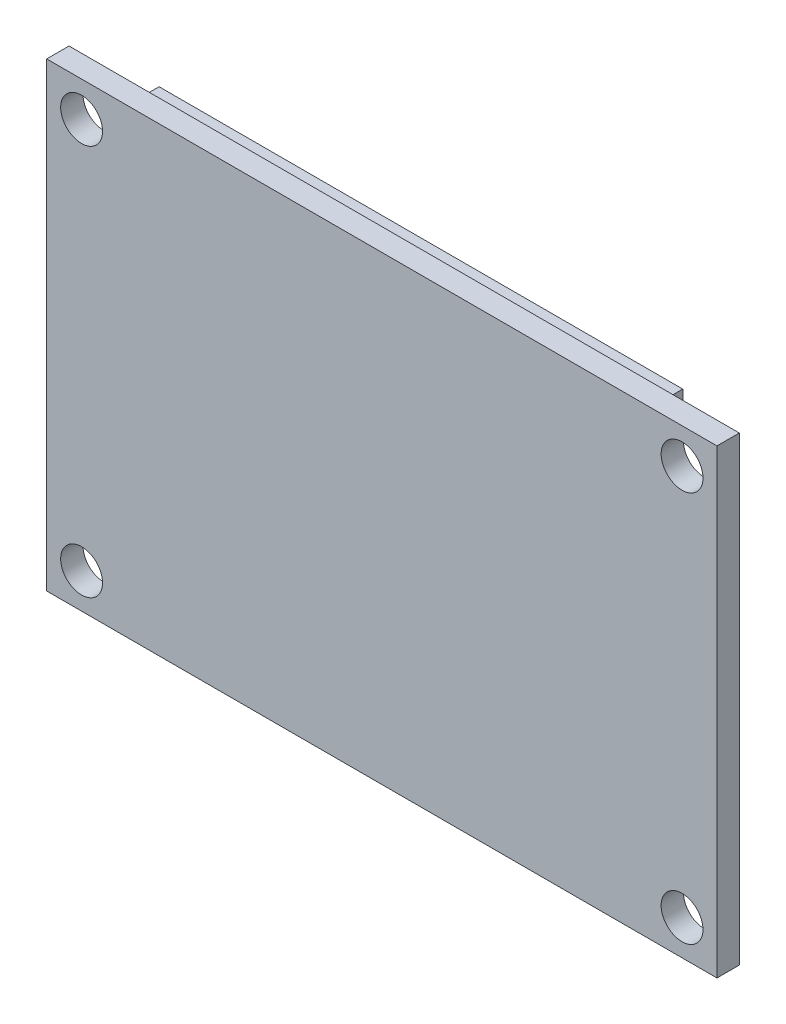
ISO-10303-21;
HEADER;
FILE_DESCRIPTION(('STEP AP214'),'2;1');
FILE_NAME('part.step','',(''),(''),'','','');
FILE_SCHEMA(('AUTOMOTIVE_DESIGN { 1 0 10303 214 1 1 1 1 }'));
ENDSEC;
DATA;
#1=APPLICATION_CONTEXT('core data for automotive mechanical design processes');
#2=APPLICATION_PROTOCOL_DEFINITION('international standard','automotive_design',2000,#1);
#3=PRODUCT_CONTEXT('',#1,'mechanical');
#4=PRODUCT('Part','Part','',(#3));
#5=PRODUCT_RELATED_PRODUCT_CATEGORY('part','',(#4));
#6=PRODUCT_DEFINITION_FORMATION('','',#4);
#7=PRODUCT_DEFINITION_CONTEXT('part definition',#1,'design');
#8=PRODUCT_DEFINITION('design','',#6,#7);
#9=PRODUCT_DEFINITION_SHAPE('','',#8);
#10=(LENGTH_UNIT() NAMED_UNIT(*) SI_UNIT(.MILLI.,.METRE.));
#11=(NAMED_UNIT(*) PLANE_ANGLE_UNIT() SI_UNIT($,.RADIAN.));
#12=(NAMED_UNIT(*) SI_UNIT($,.STERADIAN.) SOLID_ANGLE_UNIT());
#13=UNCERTAINTY_MEASURE_WITH_UNIT(LENGTH_MEASURE(1.E-05),#10,'distance_accuracy_value','');
#14=(GEOMETRIC_REPRESENTATION_CONTEXT(3) GLOBAL_UNCERTAINTY_ASSIGNED_CONTEXT((#13)) GLOBAL_UNIT_ASSIGNED_CONTEXT((#10,
#11,#12)) REPRESENTATION_CONTEXT('',''));
#15=CARTESIAN_POINT('',(0.,0.,0.));
#16=DIRECTION('',(0.,0.,1.));
#17=DIRECTION('',(1.,0.,0.));
#18=AXIS2_PLACEMENT_3D('',#15,#16,#17);
#19=CARTESIAN_POINT('',(0.,0.,1.6));
#20=DIRECTION('',(0.,0.,-1.));
#21=DIRECTION('',(-1.,0.,0.));
#22=AXIS2_PLACEMENT_3D('',#19,#20,#21);
#23=PLANE('',#22);
#24=DIRECTION('',(0.,-1.,0.));
#25=VECTOR('',#24,1.);
#26=CARTESIAN_POINT('',(-24.,16.5,1.6));
#27=LINE('',#26,#25);
#28=CARTESIAN_POINT('',(-24.,16.5,1.6));
#29=VERTEX_POINT('',#28);
#30=CARTESIAN_POINT('',(-24.,-16.5,1.6));
#31=VERTEX_POINT('',#30);
#32=EDGE_CURVE('E254',#29,#31,#27,.T.);
#33=ORIENTED_EDGE('',*,*,#32,.T.);
#34=DIRECTION('',(1.,0.,0.));
#35=VECTOR('',#34,1.);
#36=CARTESIAN_POINT('',(24.,-16.5,1.6));
#37=LINE('',#36,#35);
#38=CARTESIAN_POINT('',(24.,-16.5,1.6));
#39=VERTEX_POINT('',#38);
#40=EDGE_CURVE('E258',#31,#39,#37,.T.);
#41=ORIENTED_EDGE('',*,*,#40,.T.);
#42=DIRECTION('',(0.,1.,0.));
#43=VECTOR('',#42,1.);
#44=CARTESIAN_POINT('',(24.,16.5,1.6));
#45=LINE('',#44,#43);
#46=CARTESIAN_POINT('',(24.,16.5,1.6));
#47=VERTEX_POINT('',#46);
#48=EDGE_CURVE('E262',#39,#47,#45,.T.);
#49=ORIENTED_EDGE('',*,*,#48,.T.);
#50=DIRECTION('',(-1.,0.,0.));
#51=VECTOR('',#50,1.);
#52=CARTESIAN_POINT('',(24.,16.5,1.6));
#53=LINE('',#52,#51);
#54=EDGE_CURVE('E265',#47,#29,#53,.T.);
#55=ORIENTED_EDGE('',*,*,#54,.T.);
#56=EDGE_LOOP('',(#33,#41,#49,#55));
#57=FACE_BOUND('',#56,.T.);
#58=CARTESIAN_POINT('',(-21.5,14.,1.6));
#59=DIRECTION('',(0.,0.,1.));
#60=DIRECTION('',(1.,0.,0.));
#61=AXIS2_PLACEMENT_3D('',#58,#59,#60);
#62=CIRCLE('',#61,1.5);
#63=CARTESIAN_POINT('',(-20.,14.,1.6));
#64=VERTEX_POINT('',#63);
#65=EDGE_CURVE('E246',#64,#64,#62,.T.);
#66=ORIENTED_EDGE('',*,*,#65,.F.);
#67=EDGE_LOOP('',(#66));
#68=FACE_BOUND('',#67,.T.);
#69=CARTESIAN_POINT('',(-21.5,-14.,1.6));
#70=DIRECTION('',(0.,0.,1.));
#71=DIRECTION('',(1.,0.,0.));
#72=AXIS2_PLACEMENT_3D('',#69,#70,#71);
#73=CIRCLE('',#72,1.5);
#74=CARTESIAN_POINT('',(-20.,-14.,1.6));
#75=VERTEX_POINT('',#74);
#76=EDGE_CURVE('E238',#75,#75,#73,.T.);
#77=ORIENTED_EDGE('',*,*,#76,.F.);
#78=EDGE_LOOP('',(#77));
#79=FACE_BOUND('',#78,.T.);
#80=CARTESIAN_POINT('',(21.5,-14.,1.6));
#81=DIRECTION('',(0.,0.,1.));
#82=DIRECTION('',(-1.,0.,0.));
#83=AXIS2_PLACEMENT_3D('',#80,#81,#82);
#84=CIRCLE('',#83,1.5);
#85=CARTESIAN_POINT('',(20.,-14.,1.6));
#86=VERTEX_POINT('',#85);
#87=EDGE_CURVE('E230',#86,#86,#84,.T.);
#88=ORIENTED_EDGE('',*,*,#87,.F.);
#89=EDGE_LOOP('',(#88));
#90=FACE_BOUND('',#89,.T.);
#91=CARTESIAN_POINT('',(21.5,14.,1.6));
#92=DIRECTION('',(0.,0.,1.));
#93=DIRECTION('',(-1.,0.,0.));
#94=AXIS2_PLACEMENT_3D('',#91,#92,#93);
#95=CIRCLE('',#94,1.5);
#96=CARTESIAN_POINT('',(20.,14.,1.6));
#97=VERTEX_POINT('',#96);
#98=EDGE_CURVE('E222',#97,#97,#95,.T.);
#99=ORIENTED_EDGE('',*,*,#98,.F.);
#100=EDGE_LOOP('',(#99));
#101=FACE_BOUND('',#100,.T.);
#102=ADVANCED_FACE('F39',(#57,#68,#79,#90,#101),#23,.F.);
#103=CARTESIAN_POINT('',(0.,0.,0.));
#104=DIRECTION('',(0.,0.,-1.));
#105=DIRECTION('',(-1.,0.,0.));
#106=AXIS2_PLACEMENT_3D('',#103,#104,#105);
#107=PLANE('',#106);
#108=DIRECTION('',(0.,-1.,0.));
#109=VECTOR('',#108,1.);
#110=CARTESIAN_POINT('',(-18.75,16.,0.));
#111=LINE('',#110,#109);
#112=CARTESIAN_POINT('',(-18.75,16.,0.));
#113=VERTEX_POINT('',#112);
#114=CARTESIAN_POINT('',(-18.75,-16.,0.));
#115=VERTEX_POINT('',#114);
#116=EDGE_CURVE('E174',#113,#115,#111,.T.);
#117=ORIENTED_EDGE('',*,*,#116,.T.);
#118=DIRECTION('',(1.,0.,0.));
#119=VECTOR('',#118,1.);
#120=CARTESIAN_POINT('',(18.75,-16.,0.));
#121=LINE('',#120,#119);
#122=CARTESIAN_POINT('',(18.75,-16.,0.));
#123=VERTEX_POINT('',#122);
#124=EDGE_CURVE('E199',#115,#123,#121,.T.);
#125=ORIENTED_EDGE('',*,*,#124,.T.);
#126=DIRECTION('',(0.,1.,0.));
#127=VECTOR('',#126,1.);
#128=CARTESIAN_POINT('',(18.75,16.,0.));
#129=LINE('',#128,#127);
#130=CARTESIAN_POINT('',(18.75,16.,0.));
#131=VERTEX_POINT('',#130);
#132=EDGE_CURVE('E202',#123,#131,#129,.T.);
#133=ORIENTED_EDGE('',*,*,#132,.T.);
#134=DIRECTION('',(-1.,0.,0.));
#135=VECTOR('',#134,1.);
#136=CARTESIAN_POINT('',(18.75,16.,0.));
#137=LINE('',#136,#135);
#138=EDGE_CURVE('E63',#131,#113,#137,.T.);
#139=ORIENTED_EDGE('',*,*,#138,.T.);
#140=EDGE_LOOP('',(#117,#125,#133,#139));
#141=FACE_BOUND('',#140,.T.);
#142=CARTESIAN_POINT('',(21.5,-14.,0.));
#143=DIRECTION('',(0.,0.,1.));
#144=DIRECTION('',(-1.,0.,0.));
#145=AXIS2_PLACEMENT_3D('',#142,#143,#144);
#146=CIRCLE('',#145,1.5);
#147=CARTESIAN_POINT('',(20.,-14.,0.));
#148=VERTEX_POINT('',#147);
#149=EDGE_CURVE('E226',#148,#148,#146,.T.);
#150=ORIENTED_EDGE('',*,*,#149,.T.);
#151=EDGE_LOOP('',(#150));
#152=FACE_BOUND('',#151,.T.);
#153=CARTESIAN_POINT('',(-21.5,14.,0.));
#154=DIRECTION('',(0.,0.,1.));
#155=DIRECTION('',(1.,0.,0.));
#156=AXIS2_PLACEMENT_3D('',#153,#154,#155);
#157=CIRCLE('',#156,1.5);
#158=CARTESIAN_POINT('',(-20.,14.,0.));
#159=VERTEX_POINT('',#158);
#160=EDGE_CURVE('E242',#159,#159,#157,.T.);
#161=ORIENTED_EDGE('',*,*,#160,.T.);
#162=EDGE_LOOP('',(#161));
#163=FACE_BOUND('',#162,.T.);
#164=DIRECTION('',(0.,-1.,0.));
#165=VECTOR('',#164,1.);
#166=CARTESIAN_POINT('',(-24.,16.5,0.));
#167=LINE('',#166,#165);
#168=CARTESIAN_POINT('',(-24.,16.5,0.));
#169=VERTEX_POINT('',#168);
#170=CARTESIAN_POINT('',(-24.,-16.5,0.));
#171=VERTEX_POINT('',#170);
#172=EDGE_CURVE('E250',#169,#171,#167,.T.);
#173=ORIENTED_EDGE('',*,*,#172,.F.);
#174=DIRECTION('',(-1.,0.,0.));
#175=VECTOR('',#174,1.);
#176=CARTESIAN_POINT('',(24.,16.5,0.));
#177=LINE('',#176,#175);
#178=CARTESIAN_POINT('',(24.,16.5,0.));
#179=VERTEX_POINT('',#178);
#180=EDGE_CURVE('E259',#179,#169,#177,.T.);
#181=ORIENTED_EDGE('',*,*,#180,.F.);
#182=DIRECTION('',(0.,1.,0.));
#183=VECTOR('',#182,1.);
#184=CARTESIAN_POINT('',(24.,16.5,0.));
#185=LINE('',#184,#183);
#186=CARTESIAN_POINT('',(24.,-16.5,0.));
#187=VERTEX_POINT('',#186);
#188=EDGE_CURVE('E275',#187,#179,#185,.T.);
#189=ORIENTED_EDGE('',*,*,#188,.F.);
#190=DIRECTION('',(1.,0.,0.));
#191=VECTOR('',#190,1.);
#192=CARTESIAN_POINT('',(24.,-16.5,0.));
#193=LINE('',#192,#191);
#194=EDGE_CURVE('E272',#171,#187,#193,.T.);
#195=ORIENTED_EDGE('',*,*,#194,.F.);
#196=EDGE_LOOP('',(#173,#181,#189,#195));
#197=FACE_BOUND('',#196,.T.);
#198=CARTESIAN_POINT('',(-21.5,-14.,0.));
#199=DIRECTION('',(0.,0.,1.));
#200=DIRECTION('',(1.,0.,0.));
#201=AXIS2_PLACEMENT_3D('',#198,#199,#200);
#202=CIRCLE('',#201,1.5);
#203=CARTESIAN_POINT('',(-20.,-14.,0.));
#204=VERTEX_POINT('',#203);
#205=EDGE_CURVE('E234',#204,#204,#202,.T.);
#206=ORIENTED_EDGE('',*,*,#205,.T.);
#207=EDGE_LOOP('',(#206));
#208=FACE_BOUND('',#207,.T.);
#209=CARTESIAN_POINT('',(21.5,14.,0.));
#210=DIRECTION('',(0.,0.,1.));
#211=DIRECTION('',(-1.,0.,0.));
#212=AXIS2_PLACEMENT_3D('',#209,#210,#211);
#213=CIRCLE('',#212,1.5);
#214=CARTESIAN_POINT('',(20.,14.,0.));
#215=VERTEX_POINT('',#214);
#216=EDGE_CURVE('E210',#215,#215,#213,.T.);
#217=ORIENTED_EDGE('',*,*,#216,.T.);
#218=EDGE_LOOP('',(#217));
#219=FACE_BOUND('',#218,.T.);
#220=ADVANCED_FACE('F298',(#141,#152,#163,#197,#208,#219),#107,.T.);
#221=CARTESIAN_POINT('',(-24.,16.5,1.6));
#222=DIRECTION('',(1.,0.,0.));
#223=DIRECTION('',(0.,1.,0.));
#224=AXIS2_PLACEMENT_3D('',#221,#222,#223);
#225=PLANE('',#224);
#226=ORIENTED_EDGE('',*,*,#172,.T.);
#227=DIRECTION('',(0.,0.,-1.));
#228=VECTOR('',#227,1.);
#229=CARTESIAN_POINT('',(-24.,-16.5,1.6));
#230=LINE('',#229,#228);
#231=EDGE_CURVE('E11',#31,#171,#230,.T.);
#232=ORIENTED_EDGE('',*,*,#231,.F.);
#233=ORIENTED_EDGE('',*,*,#32,.F.);
#234=DIRECTION('',(0.,0.,-1.));
#235=VECTOR('',#234,1.);
#236=CARTESIAN_POINT('',(-24.,16.5,1.6));
#237=LINE('',#236,#235);
#238=EDGE_CURVE('E268',#29,#169,#237,.T.);
#239=ORIENTED_EDGE('',*,*,#238,.T.);
#240=EDGE_LOOP('',(#226,#232,#233,#239));
#241=FACE_BOUND('',#240,.T.);
#242=ADVANCED_FACE('F41',(#241),#225,.F.);
#243=CARTESIAN_POINT('',(24.,-16.5,1.6));
#244=DIRECTION('',(0.,1.,0.));
#245=DIRECTION('',(-1.,0.,0.));
#246=AXIS2_PLACEMENT_3D('',#243,#244,#245);
#247=PLANE('',#246);
#248=ORIENTED_EDGE('',*,*,#194,.T.);
#249=DIRECTION('',(0.,0.,-1.));
#250=VECTOR('',#249,1.);
#251=CARTESIAN_POINT('',(24.,-16.5,1.6));
#252=LINE('',#251,#250);
#253=EDGE_CURVE('E48',#39,#187,#252,.T.);
#254=ORIENTED_EDGE('',*,*,#253,.F.);
#255=ORIENTED_EDGE('',*,*,#40,.F.);
#256=ORIENTED_EDGE('',*,*,#231,.T.);
#257=EDGE_LOOP('',(#248,#254,#255,#256));
#258=FACE_BOUND('',#257,.T.);
#259=ADVANCED_FACE('F309',(#258),#247,.F.);
#260=CARTESIAN_POINT('',(24.,16.5,1.6));
#261=DIRECTION('',(-1.,0.,0.));
#262=DIRECTION('',(0.,-1.,0.));
#263=AXIS2_PLACEMENT_3D('',#260,#261,#262);
#264=PLANE('',#263);
#265=ORIENTED_EDGE('',*,*,#188,.T.);
#266=DIRECTION('',(0.,0.,-1.));
#267=VECTOR('',#266,1.);
#268=CARTESIAN_POINT('',(24.,16.5,1.6));
#269=LINE('',#268,#267);
#270=EDGE_CURVE('E283',#47,#179,#269,.T.);
#271=ORIENTED_EDGE('',*,*,#270,.F.);
#272=ORIENTED_EDGE('',*,*,#48,.F.);
#273=ORIENTED_EDGE('',*,*,#253,.T.);
#274=EDGE_LOOP('',(#265,#271,#272,#273));
#275=FACE_BOUND('',#274,.T.);
#276=ADVANCED_FACE('F292',(#275),#264,.F.);
#277=CARTESIAN_POINT('',(24.,16.5,1.6));
#278=DIRECTION('',(0.,-1.,0.));
#279=DIRECTION('',(1.,0.,0.));
#280=AXIS2_PLACEMENT_3D('',#277,#278,#279);
#281=PLANE('',#280);
#282=ORIENTED_EDGE('',*,*,#180,.T.);
#283=ORIENTED_EDGE('',*,*,#238,.F.);
#284=ORIENTED_EDGE('',*,*,#54,.F.);
#285=ORIENTED_EDGE('',*,*,#270,.T.);
#286=EDGE_LOOP('',(#282,#283,#284,#285));
#287=FACE_BOUND('',#286,.T.);
#288=ADVANCED_FACE('F302',(#287),#281,.F.);
#289=CARTESIAN_POINT('',(-21.5,14.,1.6));
#290=DIRECTION('',(0.,0.,-1.));
#291=DIRECTION('',(-1.,0.,0.));
#292=AXIS2_PLACEMENT_3D('',#289,#290,#291);
#293=CYLINDRICAL_SURFACE('',#292,1.5);
#294=ORIENTED_EDGE('',*,*,#65,.T.);
#295=EDGE_LOOP('',(#294));
#296=FACE_BOUND('',#295,.T.);
#297=ORIENTED_EDGE('',*,*,#160,.F.);
#298=EDGE_LOOP('',(#297));
#299=FACE_BOUND('',#298,.T.);
#300=ADVANCED_FACE('F323',(#296,#299),#293,.F.);
#301=CARTESIAN_POINT('',(-21.5,-14.,1.6));
#302=DIRECTION('',(0.,0.,-1.));
#303=DIRECTION('',(-1.,0.,0.));
#304=AXIS2_PLACEMENT_3D('',#301,#302,#303);
#305=CYLINDRICAL_SURFACE('',#304,1.5);
#306=ORIENTED_EDGE('',*,*,#76,.T.);
#307=EDGE_LOOP('',(#306));
#308=FACE_BOUND('',#307,.T.);
#309=ORIENTED_EDGE('',*,*,#205,.F.);
#310=EDGE_LOOP('',(#309));
#311=FACE_BOUND('',#310,.T.);
#312=ADVANCED_FACE('F330',(#308,#311),#305,.F.);
#313=CARTESIAN_POINT('',(21.5,-14.,1.6));
#314=DIRECTION('',(0.,0.,-1.));
#315=DIRECTION('',(-1.,0.,0.));
#316=AXIS2_PLACEMENT_3D('',#313,#314,#315);
#317=CYLINDRICAL_SURFACE('',#316,1.5);
#318=ORIENTED_EDGE('',*,*,#87,.T.);
#319=EDGE_LOOP('',(#318));
#320=FACE_BOUND('',#319,.T.);
#321=ORIENTED_EDGE('',*,*,#149,.F.);
#322=EDGE_LOOP('',(#321));
#323=FACE_BOUND('',#322,.T.);
#324=ADVANCED_FACE('F335',(#320,#323),#317,.F.);
#325=CARTESIAN_POINT('',(21.5,14.,1.6));
#326=DIRECTION('',(0.,0.,-1.));
#327=DIRECTION('',(-1.,0.,0.));
#328=AXIS2_PLACEMENT_3D('',#325,#326,#327);
#329=CYLINDRICAL_SURFACE('',#328,1.5);
#330=ORIENTED_EDGE('',*,*,#98,.T.);
#331=EDGE_LOOP('',(#330));
#332=FACE_BOUND('',#331,.T.);
#333=ORIENTED_EDGE('',*,*,#216,.F.);
#334=EDGE_LOOP('',(#333));
#335=FACE_BOUND('',#334,.T.);
#336=ADVANCED_FACE('F348',(#332,#335),#329,.F.);
#337=CARTESIAN_POINT('',(-18.75,16.,-1.2));
#338=DIRECTION('',(-1.,0.,0.));
#339=DIRECTION('',(0.,-1.,0.));
#340=AXIS2_PLACEMENT_3D('',#337,#338,#339);
#341=PLANE('',#340);
#342=ORIENTED_EDGE('',*,*,#116,.F.);
#343=DIRECTION('',(0.,0.,1.));
#344=VECTOR('',#343,1.);
#345=CARTESIAN_POINT('',(-18.75,16.,-1.2));
#346=LINE('',#345,#344);
#347=CARTESIAN_POINT('',(-18.75,16.,-1.2));
#348=VERTEX_POINT('',#347);
#349=EDGE_CURVE('E207',#348,#113,#346,.T.);
#350=ORIENTED_EDGE('',*,*,#349,.F.);
#351=DIRECTION('',(0.,-1.,0.));
#352=VECTOR('',#351,1.);
#353=CARTESIAN_POINT('',(-18.75,16.,-1.2));
#354=LINE('',#353,#352);
#355=CARTESIAN_POINT('',(-18.75,-16.,-1.2));
#356=VERTEX_POINT('',#355);
#357=EDGE_CURVE('E180',#348,#356,#354,.T.);
#358=ORIENTED_EDGE('',*,*,#357,.T.);
#359=DIRECTION('',(0.,0.,1.));
#360=VECTOR('',#359,1.);
#361=CARTESIAN_POINT('',(-18.75,-16.,-1.2));
#362=LINE('',#361,#360);
#363=EDGE_CURVE('E196',#356,#115,#362,.T.);
#364=ORIENTED_EDGE('',*,*,#363,.T.);
#365=EDGE_LOOP('',(#342,#350,#358,#364));
#366=FACE_BOUND('',#365,.T.);
#367=ADVANCED_FACE('F351',(#366),#341,.T.);
#368=CARTESIAN_POINT('',(18.75,16.,-1.2));
#369=DIRECTION('',(0.,1.,0.));
#370=DIRECTION('',(-1.,0.,0.));
#371=AXIS2_PLACEMENT_3D('',#368,#369,#370);
#372=PLANE('',#371);
#373=ORIENTED_EDGE('',*,*,#138,.F.);
#374=DIRECTION('',(0.,0.,1.));
#375=VECTOR('',#374,1.);
#376=CARTESIAN_POINT('',(18.75,16.,-1.2));
#377=LINE('',#376,#375);
#378=CARTESIAN_POINT('',(18.75,16.,-1.2));
#379=VERTEX_POINT('',#378);
#380=EDGE_CURVE('E211',#379,#131,#377,.T.);
#381=ORIENTED_EDGE('',*,*,#380,.F.);
#382=DIRECTION('',(-1.,0.,0.));
#383=VECTOR('',#382,1.);
#384=CARTESIAN_POINT('',(18.75,16.,-1.2));
#385=LINE('',#384,#383);
#386=EDGE_CURVE('E192',#379,#348,#385,.T.);
#387=ORIENTED_EDGE('',*,*,#386,.T.);
#388=ORIENTED_EDGE('',*,*,#349,.T.);
#389=EDGE_LOOP('',(#373,#381,#387,#388));
#390=FACE_BOUND('',#389,.T.);
#391=ADVANCED_FACE('F359',(#390),#372,.T.);
#392=CARTESIAN_POINT('',(18.75,16.,-1.2));
#393=DIRECTION('',(1.,0.,0.));
#394=DIRECTION('',(0.,1.,0.));
#395=AXIS2_PLACEMENT_3D('',#392,#393,#394);
#396=PLANE('',#395);
#397=ORIENTED_EDGE('',*,*,#132,.F.);
#398=DIRECTION('',(0.,0.,1.));
#399=VECTOR('',#398,1.);
#400=CARTESIAN_POINT('',(18.75,-16.,-1.2));
#401=LINE('',#400,#399);
#402=CARTESIAN_POINT('',(18.75,-16.,-1.2));
#403=VERTEX_POINT('',#402);
#404=EDGE_CURVE('E215',#403,#123,#401,.T.);
#405=ORIENTED_EDGE('',*,*,#404,.F.);
#406=DIRECTION('',(0.,1.,0.));
#407=VECTOR('',#406,1.);
#408=CARTESIAN_POINT('',(18.75,16.,-1.2));
#409=LINE('',#408,#407);
#410=EDGE_CURVE('E188',#403,#379,#409,.T.);
#411=ORIENTED_EDGE('',*,*,#410,.T.);
#412=ORIENTED_EDGE('',*,*,#380,.T.);
#413=EDGE_LOOP('',(#397,#405,#411,#412));
#414=FACE_BOUND('',#413,.T.);
#415=ADVANCED_FACE('F369',(#414),#396,.T.);
#416=CARTESIAN_POINT('',(18.75,-16.,-1.2));
#417=DIRECTION('',(0.,-1.,0.));
#418=DIRECTION('',(1.,0.,0.));
#419=AXIS2_PLACEMENT_3D('',#416,#417,#418);
#420=PLANE('',#419);
#421=ORIENTED_EDGE('',*,*,#124,.F.);
#422=ORIENTED_EDGE('',*,*,#363,.F.);
#423=DIRECTION('',(1.,0.,0.));
#424=VECTOR('',#423,1.);
#425=CARTESIAN_POINT('',(18.75,-16.,-1.2));
#426=LINE('',#425,#424);
#427=EDGE_CURVE('E184',#356,#403,#426,.T.);
#428=ORIENTED_EDGE('',*,*,#427,.T.);
#429=ORIENTED_EDGE('',*,*,#404,.T.);
#430=EDGE_LOOP('',(#421,#422,#428,#429));
#431=FACE_BOUND('',#430,.T.);
#432=ADVANCED_FACE('F365',(#431),#420,.T.);
#433=CARTESIAN_POINT('',(0.,0.,-1.2));
#434=DIRECTION('',(0.,0.,-1.));
#435=DIRECTION('',(-1.,0.,0.));
#436=AXIS2_PLACEMENT_3D('',#433,#434,#435);
#437=PLANE('',#436);
#438=DIRECTION('',(0.,-1.,0.));
#439=VECTOR('',#438,1.);
#440=CARTESIAN_POINT('',(16.75,-13.8,-1.2));
#441=LINE('',#440,#439);
#442=CARTESIAN_POINT('',(16.75,13.8,-1.2));
#443=VERTEX_POINT('',#442);
#444=CARTESIAN_POINT('',(16.75,-13.8,-1.2));
#445=VERTEX_POINT('',#444);
#446=EDGE_CURVE('E55',#443,#445,#441,.T.);
#447=ORIENTED_EDGE('',*,*,#446,.F.);
#448=DIRECTION('',(1.,0.,0.));
#449=VECTOR('',#448,1.);
#450=CARTESIAN_POINT('',(16.75,13.8,-1.2));
#451=LINE('',#450,#449);
#452=CARTESIAN_POINT('',(-10.85,13.8,-1.2));
#453=VERTEX_POINT('',#452);
#454=EDGE_CURVE('E152',#453,#443,#451,.T.);
#455=ORIENTED_EDGE('',*,*,#454,.F.);
#456=DIRECTION('',(0.,1.,0.));
#457=VECTOR('',#456,1.);
#458=CARTESIAN_POINT('',(-10.85,-13.8,-1.2));
#459=LINE('',#458,#457);
#460=CARTESIAN_POINT('',(-10.85,-13.8,-1.2));
#461=VERTEX_POINT('',#460);
#462=EDGE_CURVE('E156',#461,#453,#459,.T.);
#463=ORIENTED_EDGE('',*,*,#462,.F.);
#464=DIRECTION('',(-1.,0.,0.));
#465=VECTOR('',#464,1.);
#466=CARTESIAN_POINT('',(16.75,-13.8,-1.2));
#467=LINE('',#466,#465);
#468=EDGE_CURVE('E165',#445,#461,#467,.T.);
#469=ORIENTED_EDGE('',*,*,#468,.F.);
#470=EDGE_LOOP('',(#447,#455,#463,#469));
#471=FACE_BOUND('',#470,.T.);
#472=ORIENTED_EDGE('',*,*,#357,.F.);
#473=ORIENTED_EDGE('',*,*,#386,.F.);
#474=ORIENTED_EDGE('',*,*,#410,.F.);
#475=ORIENTED_EDGE('',*,*,#427,.F.);
#476=EDGE_LOOP('',(#472,#473,#474,#475));
#477=FACE_BOUND('',#476,.T.);
#478=ADVANCED_FACE('F368',(#471,#477),#437,.T.);
#479=CARTESIAN_POINT('',(16.75,-13.8,-0.7));
#480=DIRECTION('',(1.,0.,0.));
#481=DIRECTION('',(0.,0.,-1.));
#482=AXIS2_PLACEMENT_3D('',#479,#480,#481);
#483=PLANE('',#482);
#484=ORIENTED_EDGE('',*,*,#446,.T.);
#485=DIRECTION('',(0.,0.,-1.));
#486=VECTOR('',#485,1.);
#487=CARTESIAN_POINT('',(16.75,-13.8,-0.7));
#488=LINE('',#487,#486);
#489=CARTESIAN_POINT('',(16.75,-13.8,-0.7));
#490=VERTEX_POINT('',#489);
#491=EDGE_CURVE('E127',#490,#445,#488,.T.);
#492=ORIENTED_EDGE('',*,*,#491,.F.);
#493=DIRECTION('',(0.,-1.,0.));
#494=VECTOR('',#493,1.);
#495=CARTESIAN_POINT('',(16.75,-13.8,-0.7));
#496=LINE('',#495,#494);
#497=CARTESIAN_POINT('',(16.75,13.8,-0.7));
#498=VERTEX_POINT('',#497);
#499=EDGE_CURVE('E131',#498,#490,#496,.T.);
#500=ORIENTED_EDGE('',*,*,#499,.F.);
#501=DIRECTION('',(0.,0.,-1.));
#502=VECTOR('',#501,1.);
#503=CARTESIAN_POINT('',(16.75,13.8,-0.7));
#504=LINE('',#503,#502);
#505=EDGE_CURVE('E171',#498,#443,#504,.T.);
#506=ORIENTED_EDGE('',*,*,#505,.T.);
#507=EDGE_LOOP('',(#484,#492,#500,#506));
#508=FACE_BOUND('',#507,.T.);
#509=ADVANCED_FACE('F129',(#508),#483,.F.);
#510=CARTESIAN_POINT('',(16.75,13.8,-0.7));
#511=DIRECTION('',(0.,1.,0.));
#512=DIRECTION('',(-1.,0.,0.));
#513=AXIS2_PLACEMENT_3D('',#510,#511,#512);
#514=PLANE('',#513);
#515=ORIENTED_EDGE('',*,*,#454,.T.);
#516=ORIENTED_EDGE('',*,*,#505,.F.);
#517=DIRECTION('',(1.,0.,0.));
#518=VECTOR('',#517,1.);
#519=CARTESIAN_POINT('',(16.75,13.8,-0.7));
#520=LINE('',#519,#518);
#521=CARTESIAN_POINT('',(-10.85,13.8,-0.7));
#522=VERTEX_POINT('',#521);
#523=EDGE_CURVE('E138',#522,#498,#520,.T.);
#524=ORIENTED_EDGE('',*,*,#523,.F.);
#525=DIRECTION('',(0.,0.,-1.));
#526=VECTOR('',#525,1.);
#527=CARTESIAN_POINT('',(-10.85,13.8,-0.7));
#528=LINE('',#527,#526);
#529=EDGE_CURVE('E175',#522,#453,#528,.T.);
#530=ORIENTED_EDGE('',*,*,#529,.T.);
#531=EDGE_LOOP('',(#515,#516,#524,#530));
#532=FACE_BOUND('',#531,.T.);
#533=ADVANCED_FACE('F382',(#532),#514,.F.);
#534=CARTESIAN_POINT('',(-10.85,-13.8,-0.7));
#535=DIRECTION('',(-1.,0.,0.));
#536=DIRECTION('',(0.,0.,1.));
#537=AXIS2_PLACEMENT_3D('',#534,#535,#536);
#538=PLANE('',#537);
#539=ORIENTED_EDGE('',*,*,#462,.T.);
#540=ORIENTED_EDGE('',*,*,#529,.F.);
#541=DIRECTION('',(0.,1.,0.));
#542=VECTOR('',#541,1.);
#543=CARTESIAN_POINT('',(-10.85,-13.8,-0.7));
#544=LINE('',#543,#542);
#545=CARTESIAN_POINT('',(-10.85,-13.8,-0.7));
#546=VERTEX_POINT('',#545);
#547=EDGE_CURVE('E147',#546,#522,#544,.T.);
#548=ORIENTED_EDGE('',*,*,#547,.F.);
#549=DIRECTION('',(0.,0.,-1.));
#550=VECTOR('',#549,1.);
#551=CARTESIAN_POINT('',(-10.85,-13.8,-0.7));
#552=LINE('',#551,#550);
#553=EDGE_CURVE('E137',#546,#461,#552,.T.);
#554=ORIENTED_EDGE('',*,*,#553,.T.);
#555=EDGE_LOOP('',(#539,#540,#548,#554));
#556=FACE_BOUND('',#555,.T.);
#557=ADVANCED_FACE('F385',(#556),#538,.F.);
#558=CARTESIAN_POINT('',(16.75,-13.8,-0.7));
#559=DIRECTION('',(0.,-1.,0.));
#560=DIRECTION('',(1.,0.,0.));
#561=AXIS2_PLACEMENT_3D('',#558,#559,#560);
#562=PLANE('',#561);
#563=ORIENTED_EDGE('',*,*,#468,.T.);
#564=ORIENTED_EDGE('',*,*,#553,.F.);
#565=DIRECTION('',(-1.,0.,0.));
#566=VECTOR('',#565,1.);
#567=CARTESIAN_POINT('',(16.75,-13.8,-0.7));
#568=LINE('',#567,#566);
#569=EDGE_CURVE('E141',#490,#546,#568,.T.);
#570=ORIENTED_EDGE('',*,*,#569,.F.);
#571=ORIENTED_EDGE('',*,*,#491,.T.);
#572=EDGE_LOOP('',(#563,#564,#570,#571));
#573=FACE_BOUND('',#572,.T.);
#574=ADVANCED_FACE('F142',(#573),#562,.F.);
#575=CARTESIAN_POINT('',(0.,0.,-0.7));
#576=DIRECTION('',(0.,0.,1.));
#577=DIRECTION('',(1.,0.,0.));
#578=AXIS2_PLACEMENT_3D('',#575,#576,#577);
#579=PLANE('',#578);
#580=ORIENTED_EDGE('',*,*,#499,.T.);
#581=ORIENTED_EDGE('',*,*,#569,.T.);
#582=ORIENTED_EDGE('',*,*,#547,.T.);
#583=ORIENTED_EDGE('',*,*,#523,.T.);
#584=EDGE_LOOP('',(#580,#581,#582,#583));
#585=FACE_BOUND('',#584,.T.);
#586=ADVANCED_FACE('F149',(#585),#579,.F.);
#587=CLOSED_SHELL('',(#102,#220,#242,#259,#276,#288,#300,#312,#324,#336,#367,#391,#415,#432,
#478,#509,#533,#557,#574,#586));
#588=MANIFOLD_SOLID_BREP('B2',#587);
#589=ADVANCED_BREP_SHAPE_REPRESENTATION('',(#18,#588),#14);
#590=SHAPE_DEFINITION_REPRESENTATION(#9,#589);
ENDSEC;
END-ISO-10303-21;
